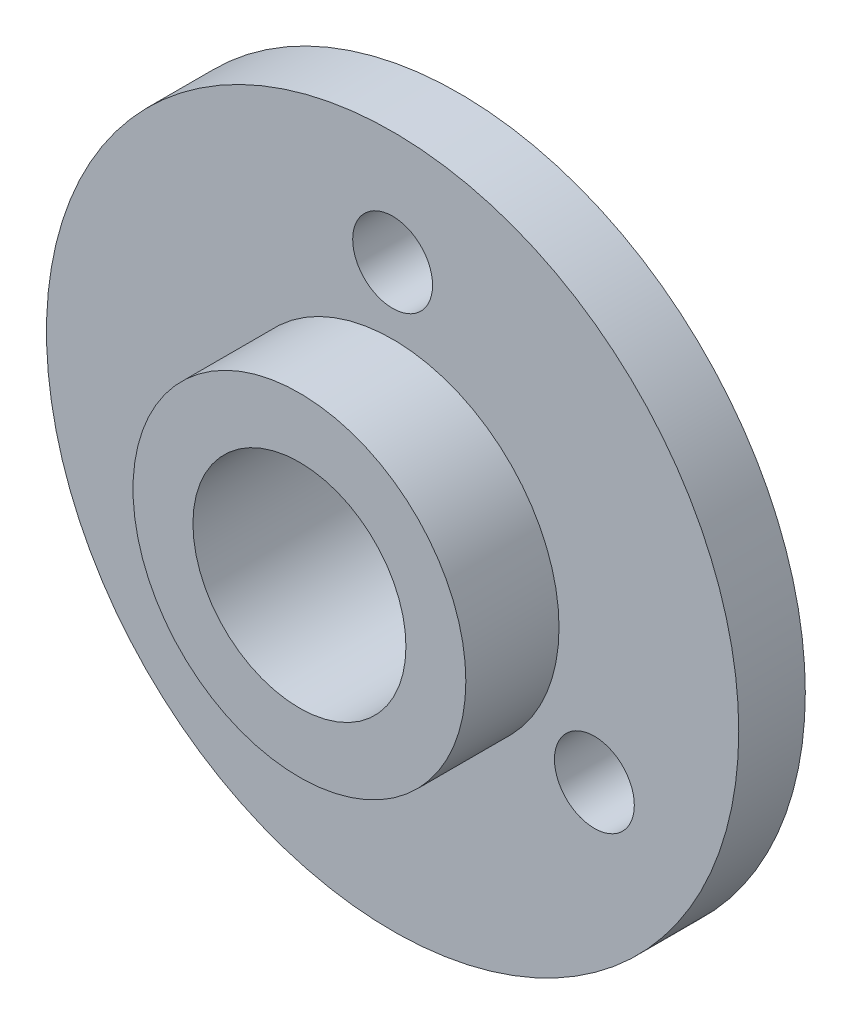
ISO-10303-21;
HEADER;
FILE_DESCRIPTION(('STEP AP214'),'2;1');
FILE_NAME('part.step','',(''),(''),'','','');
FILE_SCHEMA(('AUTOMOTIVE_DESIGN { 1 0 10303 214 1 1 1 1 }'));
ENDSEC;
DATA;
#1=APPLICATION_CONTEXT('core data for automotive mechanical design processes');
#2=APPLICATION_PROTOCOL_DEFINITION('international standard','automotive_design',2000,#1);
#3=PRODUCT_CONTEXT('',#1,'mechanical');
#4=PRODUCT('Part','Part','',(#3));
#5=PRODUCT_RELATED_PRODUCT_CATEGORY('part','',(#4));
#6=PRODUCT_DEFINITION_FORMATION('','',#4);
#7=PRODUCT_DEFINITION_CONTEXT('part definition',#1,'design');
#8=PRODUCT_DEFINITION('design','',#6,#7);
#9=PRODUCT_DEFINITION_SHAPE('','',#8);
#10=(LENGTH_UNIT() NAMED_UNIT(*) SI_UNIT(.MILLI.,.METRE.));
#11=(NAMED_UNIT(*) PLANE_ANGLE_UNIT() SI_UNIT($,.RADIAN.));
#12=(NAMED_UNIT(*) SI_UNIT($,.STERADIAN.) SOLID_ANGLE_UNIT());
#13=UNCERTAINTY_MEASURE_WITH_UNIT(LENGTH_MEASURE(1.E-05),#10,'distance_accuracy_value','');
#14=(GEOMETRIC_REPRESENTATION_CONTEXT(3) GLOBAL_UNCERTAINTY_ASSIGNED_CONTEXT((#13)) GLOBAL_UNIT_ASSIGNED_CONTEXT((#10,
#11,#12)) REPRESENTATION_CONTEXT('',''));
#15=CARTESIAN_POINT('',(0.,0.,0.));
#16=DIRECTION('',(0.,0.,1.));
#17=DIRECTION('',(1.,0.,0.));
#18=AXIS2_PLACEMENT_3D('',#15,#16,#17);
#19=CARTESIAN_POINT('',(0.,0.,5.));
#20=DIRECTION('',(0.,0.,-1.));
#21=DIRECTION('',(-1.,0.,0.));
#22=AXIS2_PLACEMENT_3D('',#19,#20,#21);
#23=CYLINDRICAL_SURFACE('',#22,26.);
#24=CARTESIAN_POINT('',(0.,0.,5.));
#25=DIRECTION('',(0.,0.,1.));
#26=DIRECTION('',(1.,0.,0.));
#27=AXIS2_PLACEMENT_3D('',#24,#25,#26);
#28=CIRCLE('',#27,26.);
#29=CARTESIAN_POINT('',(26.,0.,5.));
#30=VERTEX_POINT('',#29);
#31=EDGE_CURVE('E11',#30,#30,#28,.T.);
#32=ORIENTED_EDGE('',*,*,#31,.F.);
#33=EDGE_LOOP('',(#32));
#34=FACE_BOUND('',#33,.T.);
#35=CARTESIAN_POINT('',(0.,0.,0.));
#36=DIRECTION('',(0.,0.,1.));
#37=DIRECTION('',(1.,0.,0.));
#38=AXIS2_PLACEMENT_3D('',#35,#36,#37);
#39=CIRCLE('',#38,26.);
#40=CARTESIAN_POINT('',(26.,0.,0.));
#41=VERTEX_POINT('',#40);
#42=EDGE_CURVE('E78',#41,#41,#39,.T.);
#43=ORIENTED_EDGE('',*,*,#42,.T.);
#44=EDGE_LOOP('',(#43));
#45=FACE_BOUND('',#44,.T.);
#46=ADVANCED_FACE('F80',(#34,#45),#23,.T.);
#47=CARTESIAN_POINT('',(0.,0.,5.));
#48=DIRECTION('',(0.,0.,1.));
#49=DIRECTION('',(1.,0.,0.));
#50=AXIS2_PLACEMENT_3D('',#47,#48,#49);
#51=PLANE('',#50);
#52=CARTESIAN_POINT('',(0.,17.5,5.));
#53=DIRECTION('',(0.,0.,1.));
#54=DIRECTION('',(1.,0.,0.));
#55=AXIS2_PLACEMENT_3D('',#52,#53,#54);
#56=CIRCLE('',#55,3.);
#57=CARTESIAN_POINT('',(3.,17.5,5.));
#58=VERTEX_POINT('',#57);
#59=EDGE_CURVE('E98',#58,#58,#56,.T.);
#60=ORIENTED_EDGE('',*,*,#59,.F.);
#61=EDGE_LOOP('',(#60));
#62=FACE_BOUND('',#61,.T.);
#63=CARTESIAN_POINT('',(-15.1554445662275,-8.74999999999999,5.));
#64=DIRECTION('',(0.,0.,1.));
#65=DIRECTION('',(1.,0.,0.));
#66=AXIS2_PLACEMENT_3D('',#63,#64,#65);
#67=CIRCLE('',#66,3.);
#68=CARTESIAN_POINT('',(-12.1554445662275,-8.74999999999999,5.));
#69=VERTEX_POINT('',#68);
#70=EDGE_CURVE('E108',#69,#69,#67,.T.);
#71=ORIENTED_EDGE('',*,*,#70,.F.);
#72=EDGE_LOOP('',(#71));
#73=FACE_BOUND('',#72,.T.);
#74=CARTESIAN_POINT('',(15.1554445662278,-8.74999999999986,5.));
#75=DIRECTION('',(0.,0.,1.));
#76=DIRECTION('',(1.,0.,0.));
#77=AXIS2_PLACEMENT_3D('',#74,#75,#76);
#78=CIRCLE('',#77,3.);
#79=CARTESIAN_POINT('',(18.1554445662278,-8.74999999999986,5.));
#80=VERTEX_POINT('',#79);
#81=EDGE_CURVE('E114',#80,#80,#78,.T.);
#82=ORIENTED_EDGE('',*,*,#81,.F.);
#83=EDGE_LOOP('',(#82));
#84=FACE_BOUND('',#83,.T.);
#85=CARTESIAN_POINT('',(0.,0.,5.));
#86=DIRECTION('',(0.,0.,1.));
#87=DIRECTION('',(1.,0.,0.));
#88=AXIS2_PLACEMENT_3D('',#85,#86,#87);
#89=CIRCLE('',#88,12.5);
#90=CARTESIAN_POINT('',(12.5,0.,5.));
#91=VERTEX_POINT('',#90);
#92=EDGE_CURVE('E82',#91,#91,#89,.T.);
#93=ORIENTED_EDGE('',*,*,#92,.F.);
#94=EDGE_LOOP('',(#93));
#95=FACE_BOUND('',#94,.T.);
#96=ORIENTED_EDGE('',*,*,#31,.T.);
#97=EDGE_LOOP('',(#96));
#98=FACE_BOUND('',#97,.T.);
#99=ADVANCED_FACE('F136',(#62,#73,#84,#95,#98),#51,.T.);
#100=CARTESIAN_POINT('',(0.,0.,0.));
#101=DIRECTION('',(0.,0.,1.));
#102=DIRECTION('',(1.,0.,0.));
#103=AXIS2_PLACEMENT_3D('',#100,#101,#102);
#104=PLANE('',#103);
#105=CARTESIAN_POINT('',(0.,17.5,0.));
#106=DIRECTION('',(0.,0.,-1.));
#107=DIRECTION('',(-1.,0.,0.));
#108=AXIS2_PLACEMENT_3D('',#105,#106,#107);
#109=CIRCLE('',#108,3.);
#110=CARTESIAN_POINT('',(-3.,17.5,0.));
#111=VERTEX_POINT('',#110);
#112=EDGE_CURVE('E120',#111,#111,#109,.T.);
#113=ORIENTED_EDGE('',*,*,#112,.F.);
#114=EDGE_LOOP('',(#113));
#115=FACE_BOUND('',#114,.T.);
#116=CARTESIAN_POINT('',(-15.1554445662275,-8.74999999999999,0.));
#117=DIRECTION('',(0.,0.,-1.));
#118=DIRECTION('',(-1.,0.,0.));
#119=AXIS2_PLACEMENT_3D('',#116,#117,#118);
#120=CIRCLE('',#119,3.);
#121=CARTESIAN_POINT('',(-18.1554445662275,-8.74999999999999,0.));
#122=VERTEX_POINT('',#121);
#123=EDGE_CURVE('E125',#122,#122,#120,.T.);
#124=ORIENTED_EDGE('',*,*,#123,.F.);
#125=EDGE_LOOP('',(#124));
#126=FACE_BOUND('',#125,.T.);
#127=CARTESIAN_POINT('',(15.1554445662278,-8.74999999999986,0.));
#128=DIRECTION('',(0.,0.,-1.));
#129=DIRECTION('',(-1.,0.,0.));
#130=AXIS2_PLACEMENT_3D('',#127,#128,#129);
#131=CIRCLE('',#130,3.);
#132=CARTESIAN_POINT('',(12.1554445662278,-8.74999999999986,0.));
#133=VERTEX_POINT('',#132);
#134=EDGE_CURVE('E119',#133,#133,#131,.T.);
#135=ORIENTED_EDGE('',*,*,#134,.F.);
#136=EDGE_LOOP('',(#135));
#137=FACE_BOUND('',#136,.T.);
#138=ORIENTED_EDGE('',*,*,#42,.F.);
#139=EDGE_LOOP('',(#138));
#140=FACE_BOUND('',#139,.T.);
#141=CARTESIAN_POINT('',(0.,0.,0.));
#142=DIRECTION('',(0.,0.,1.));
#143=DIRECTION('',(1.,0.,0.));
#144=AXIS2_PLACEMENT_3D('',#141,#142,#143);
#145=CIRCLE('',#144,8.);
#146=CARTESIAN_POINT('',(8.,0.,0.));
#147=VERTEX_POINT('',#146);
#148=EDGE_CURVE('E91',#147,#147,#145,.T.);
#149=ORIENTED_EDGE('',*,*,#148,.T.);
#150=EDGE_LOOP('',(#149));
#151=FACE_BOUND('',#150,.T.);
#152=ADVANCED_FACE('F134',(#115,#126,#137,#140,#151),#104,.F.);
#153=CARTESIAN_POINT('',(0.,0.,12.));
#154=DIRECTION('',(0.,0.,-1.));
#155=DIRECTION('',(-1.,0.,0.));
#156=AXIS2_PLACEMENT_3D('',#153,#154,#155);
#157=CYLINDRICAL_SURFACE('',#156,8.);
#158=CARTESIAN_POINT('',(0.,0.,12.));
#159=DIRECTION('',(0.,0.,1.));
#160=DIRECTION('',(1.,0.,0.));
#161=AXIS2_PLACEMENT_3D('',#158,#159,#160);
#162=CIRCLE('',#161,8.);
#163=CARTESIAN_POINT('',(8.,0.,12.));
#164=VERTEX_POINT('',#163);
#165=EDGE_CURVE('E100',#164,#164,#162,.T.);
#166=ORIENTED_EDGE('',*,*,#165,.T.);
#167=EDGE_LOOP('',(#166));
#168=FACE_BOUND('',#167,.T.);
#169=ORIENTED_EDGE('',*,*,#148,.F.);
#170=EDGE_LOOP('',(#169));
#171=FACE_BOUND('',#170,.T.);
#172=ADVANCED_FACE('F139',(#168,#171),#157,.F.);
#173=CARTESIAN_POINT('',(0.,0.,12.));
#174=DIRECTION('',(0.,0.,-1.));
#175=DIRECTION('',(-1.,0.,0.));
#176=AXIS2_PLACEMENT_3D('',#173,#174,#175);
#177=CYLINDRICAL_SURFACE('',#176,12.5);
#178=ORIENTED_EDGE('',*,*,#92,.T.);
#179=EDGE_LOOP('',(#178));
#180=FACE_BOUND('',#179,.T.);
#181=CARTESIAN_POINT('',(0.,0.,12.));
#182=DIRECTION('',(0.,0.,1.));
#183=DIRECTION('',(1.,0.,0.));
#184=AXIS2_PLACEMENT_3D('',#181,#182,#183);
#185=CIRCLE('',#184,12.5);
#186=CARTESIAN_POINT('',(12.5,0.,12.));
#187=VERTEX_POINT('',#186);
#188=EDGE_CURVE('E97',#187,#187,#185,.T.);
#189=ORIENTED_EDGE('',*,*,#188,.F.);
#190=EDGE_LOOP('',(#189));
#191=FACE_BOUND('',#190,.T.);
#192=ADVANCED_FACE('F146',(#180,#191),#177,.T.);
#193=CARTESIAN_POINT('',(0.,0.,12.));
#194=DIRECTION('',(0.,0.,1.));
#195=DIRECTION('',(1.,0.,0.));
#196=AXIS2_PLACEMENT_3D('',#193,#194,#195);
#197=PLANE('',#196);
#198=ORIENTED_EDGE('',*,*,#165,.F.);
#199=EDGE_LOOP('',(#198));
#200=FACE_BOUND('',#199,.T.);
#201=ORIENTED_EDGE('',*,*,#188,.T.);
#202=EDGE_LOOP('',(#201));
#203=FACE_BOUND('',#202,.T.);
#204=ADVANCED_FACE('F154',(#200,#203),#197,.T.);
#205=CARTESIAN_POINT('',(15.1554445662278,-8.74999999999986,12.));
#206=DIRECTION('',(0.,0.,-1.));
#207=DIRECTION('',(-1.,0.,0.));
#208=AXIS2_PLACEMENT_3D('',#205,#206,#207);
#209=CYLINDRICAL_SURFACE('',#208,3.);
#210=ORIENTED_EDGE('',*,*,#81,.T.);
#211=EDGE_LOOP('',(#210));
#212=FACE_BOUND('',#211,.T.);
#213=ORIENTED_EDGE('',*,*,#134,.T.);
#214=EDGE_LOOP('',(#213));
#215=FACE_BOUND('',#214,.T.);
#216=ADVANCED_FACE('F190',(#212,#215),#209,.F.);
#217=CARTESIAN_POINT('',(-15.1554445662275,-8.74999999999999,12.));
#218=DIRECTION('',(0.,0.,-1.));
#219=DIRECTION('',(-1.,0.,0.));
#220=AXIS2_PLACEMENT_3D('',#217,#218,#219);
#221=CYLINDRICAL_SURFACE('',#220,3.);
#222=ORIENTED_EDGE('',*,*,#70,.T.);
#223=EDGE_LOOP('',(#222));
#224=FACE_BOUND('',#223,.T.);
#225=ORIENTED_EDGE('',*,*,#123,.T.);
#226=EDGE_LOOP('',(#225));
#227=FACE_BOUND('',#226,.T.);
#228=ADVANCED_FACE('F195',(#224,#227),#221,.F.);
#229=CARTESIAN_POINT('',(0.,17.5,12.));
#230=DIRECTION('',(0.,0.,-1.));
#231=DIRECTION('',(-1.,0.,0.));
#232=AXIS2_PLACEMENT_3D('',#229,#230,#231);
#233=CYLINDRICAL_SURFACE('',#232,3.);
#234=ORIENTED_EDGE('',*,*,#59,.T.);
#235=EDGE_LOOP('',(#234));
#236=FACE_BOUND('',#235,.T.);
#237=ORIENTED_EDGE('',*,*,#112,.T.);
#238=EDGE_LOOP('',(#237));
#239=FACE_BOUND('',#238,.T.);
#240=ADVANCED_FACE('F132',(#236,#239),#233,.F.);
#241=CLOSED_SHELL('',(#46,#99,#152,#172,#192,#204,#216,#228,#240));
#242=MANIFOLD_SOLID_BREP('B2',#241);
#243=ADVANCED_BREP_SHAPE_REPRESENTATION('',(#18,#242),#14);
#244=SHAPE_DEFINITION_REPRESENTATION(#9,#243);
ENDSEC;
END-ISO-10303-21;
